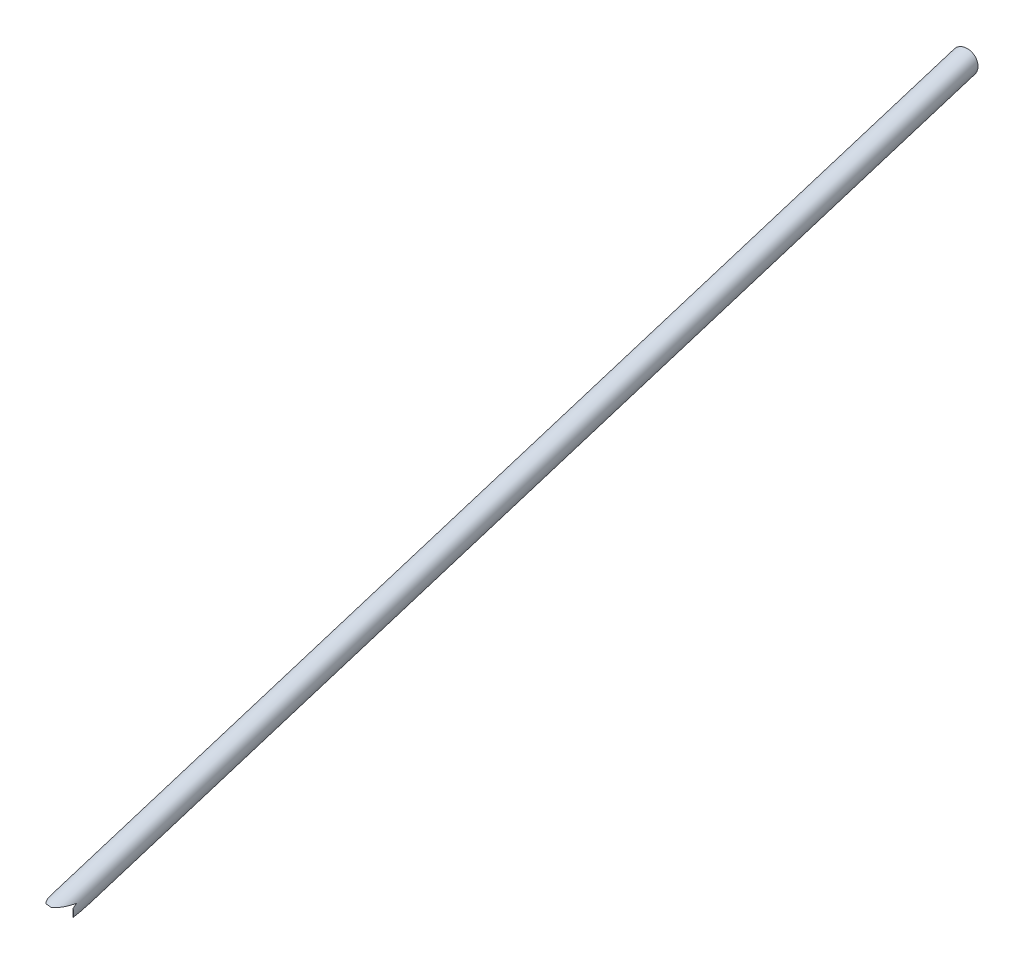
ISO-10303-21;
HEADER;
FILE_DESCRIPTION(('STEP AP214'),'2;1');
FILE_NAME('part.step','',(''),(''),'','','');
FILE_SCHEMA(('AUTOMOTIVE_DESIGN { 1 0 10303 214 1 1 1 1 }'));
ENDSEC;
DATA;
#1=APPLICATION_CONTEXT('core data for automotive mechanical design processes');
#2=APPLICATION_PROTOCOL_DEFINITION('international standard','automotive_design',2000,#1);
#3=PRODUCT_CONTEXT('',#1,'mechanical');
#4=PRODUCT('Part','Part','',(#3));
#5=PRODUCT_RELATED_PRODUCT_CATEGORY('part','',(#4));
#6=PRODUCT_DEFINITION_FORMATION('','',#4);
#7=PRODUCT_DEFINITION_CONTEXT('part definition',#1,'design');
#8=PRODUCT_DEFINITION('design','',#6,#7);
#9=PRODUCT_DEFINITION_SHAPE('','',#8);
#10=(LENGTH_UNIT() NAMED_UNIT(*) SI_UNIT(.MILLI.,.METRE.));
#11=(NAMED_UNIT(*) PLANE_ANGLE_UNIT() SI_UNIT($,.RADIAN.));
#12=(NAMED_UNIT(*) SI_UNIT($,.STERADIAN.) SOLID_ANGLE_UNIT());
#13=UNCERTAINTY_MEASURE_WITH_UNIT(LENGTH_MEASURE(1.E-05),#10,'distance_accuracy_value','');
#14=(GEOMETRIC_REPRESENTATION_CONTEXT(3) GLOBAL_UNCERTAINTY_ASSIGNED_CONTEXT((#13)) GLOBAL_UNIT_ASSIGNED_CONTEXT((#10,
#11,#12)) REPRESENTATION_CONTEXT('',''));
#15=CARTESIAN_POINT('',(0.,0.,0.));
#16=DIRECTION('',(0.,0.,1.));
#17=DIRECTION('',(1.,0.,0.));
#18=AXIS2_PLACEMENT_3D('',#15,#16,#17);
#19=CARTESIAN_POINT('',(-160.,500.,-1140.));
#20=DIRECTION('',(-0.0860700691861797,-0.397246473166983,0.913666888284061));
#21=DIRECTION('',(0.,-0.917070056253235,-0.39872611141445));
#22=AXIS2_PLACEMENT_3D('',#19,#20,#21);
#23=CYLINDRICAL_SURFACE('',#22,9.49999999999999);
#24=CARTESIAN_POINT('',(-225.,200.,-450.));
#25=DIRECTION('',(-0.49863554461385,-0.838230795587621,-0.220752637529415));
#26=DIRECTION('',(0.000808316338371599,-0.255121494909782,0.966908666555272));
#27=AXIS2_PLACEMENT_3D('',#24,#25,#26);
#28=ELLIPSE('',#27,54.5326857587044,9.49999999999999);
#29=CARTESIAN_POINT('',(-232.49120207117,210.,-471.05038645659));
#30=VERTEX_POINT('',#29);
#31=CARTESIAN_POINT('',(-221.081106849014,210.,-496.823483026899));
#32=VERTEX_POINT('',#31);
#33=EDGE_CURVE('E119',#30,#32,#28,.T.);
#34=ORIENTED_EDGE('',*,*,#33,.F.);
#35=CARTESIAN_POINT('',(-222.833333333333,210.,-473.));
#36=DIRECTION('',(0.,-1.,0.));
#37=DIRECTION('',(-0.0937876730808621,0.,0.995592221935305));
#38=AXIS2_PLACEMENT_3D('',#35,#36,#37);
#39=ELLIPSE('',#38,23.9146238965013,9.49999999999999);
#40=CARTESIAN_POINT('',(-227.003347225942,210.,-449.90274755166));
#41=VERTEX_POINT('',#40);
#42=EDGE_CURVE('E105',#41,#30,#39,.T.);
#43=ORIENTED_EDGE('',*,*,#42,.F.);
#44=CARTESIAN_POINT('',(-225.,200.,-450.));
#45=DIRECTION('',(-0.0976173982014038,-0.0292307759670222,0.994794654843277));
#46=DIRECTION('',(0.0124481025124146,-0.999526246810149,-0.0281482980206314));
#47=AXIS2_PLACEMENT_3D('',#44,#45,#46);
#48=ELLIPSE('',#47,10.2268785020854,9.49999999999999);
#49=CARTESIAN_POINT('',(-223.080085976711,210.,-449.517765029136));
#50=VERTEX_POINT('',#49);
#51=EDGE_CURVE('E113',#50,#41,#48,.T.);
#52=ORIENTED_EDGE('',*,*,#51,.F.);
#53=CARTESIAN_POINT('',(-215.,210.,-462.889777741708));
#54=VERTEX_POINT('',#53);
#55=EDGE_CURVE('E108',#54,#50,#39,.T.);
#56=ORIENTED_EDGE('',*,*,#55,.F.);
#57=CARTESIAN_POINT('',(-215.,246.153846153847,-556.153846153848));
#58=DIRECTION('',(-1.,0.,0.));
#59=DIRECTION('',(0.,-0.39872611141445,0.917070056253235));
#60=AXIS2_PLACEMENT_3D('',#57,#58,#59);
#61=ELLIPSE('',#60,110.375187214621,9.49999999999999);
#62=CARTESIAN_POINT('',(-215.,207.970881077854,-460.));
#63=VERTEX_POINT('',#62);
#64=EDGE_CURVE('E170',#63,#54,#61,.T.);
#65=ORIENTED_EDGE('',*,*,#64,.F.);
#66=CARTESIAN_POINT('',(-224.057971014493,204.347826086957,-460.));
#67=DIRECTION('',(0.,0.,1.));
#68=DIRECTION('',(-0.211753347005806,-0.977323140026797,0.));
#69=AXIS2_PLACEMENT_3D('',#66,#67,#68);
#70=ELLIPSE('',#69,10.3976625636962,9.49999999999999);
#71=CARTESIAN_POINT('',(-215.,201.460233271805,-460.));
#72=VERTEX_POINT('',#71);
#73=EDGE_CURVE('E124',#72,#63,#70,.T.);
#74=ORIENTED_EDGE('',*,*,#73,.F.);
#75=CARTESIAN_POINT('',(-215.,210.,-490.567372696074));
#76=VERTEX_POINT('',#75);
#77=EDGE_CURVE('E120',#76,#72,#61,.T.);
#78=ORIENTED_EDGE('',*,*,#77,.F.);
#79=CARTESIAN_POINT('',(-222.833333333333,210.,-473.));
#80=DIRECTION('',(0.,-1.,0.));
#81=DIRECTION('',(-0.0937876730808621,0.,0.995592221935305));
#82=AXIS2_PLACEMENT_3D('',#79,#80,#81);
#83=ELLIPSE('',#82,23.9146238965013,9.49999999999999);
#84=EDGE_CURVE('E172',#32,#76,#83,.T.);
#85=ORIENTED_EDGE('',*,*,#84,.F.);
#86=EDGE_LOOP('',(#34,#43,#52,#56,#65,#74,#78,#85));
#87=FACE_BOUND('',#86,.T.);
#88=CARTESIAN_POINT('',(-160.,500.,-1140.));
#89=DIRECTION('',(-0.133991346812806,0.0219122293107185,-0.990740214781819));
#90=DIRECTION('',(-0.480296136468892,-0.8759210569698,0.0455842434396291));
#91=AXIS2_PLACEMENT_3D('',#88,#89,#90);
#92=ELLIPSE('',#91,10.5277337911105,9.49999999999999);
#93=CARTESIAN_POINT('',(-165.056429865643,490.778536290194,-1139.52010122));
#94=VERTEX_POINT('',#93);
#95=EDGE_CURVE('E11',#94,#94,#92,.T.);
#96=ORIENTED_EDGE('',*,*,#95,.F.);
#97=EDGE_LOOP('',(#96));
#98=FACE_BOUND('',#97,.T.);
#99=ADVANCED_FACE('F41',(#87,#98),#23,.T.);
#100=CARTESIAN_POINT('',(-160.,500.,-1140.));
#101=DIRECTION('',(-0.0860700691861797,-0.397246473166983,0.913666888284061));
#102=DIRECTION('',(0.,-0.917070056253235,-0.39872611141445));
#103=AXIS2_PLACEMENT_3D('',#100,#101,#102);
#104=CYLINDRICAL_SURFACE('',#103,7.90000000000002);
#105=CARTESIAN_POINT('',(-222.833333333333,210.,-473.));
#106=DIRECTION('',(0.,-1.,0.));
#107=DIRECTION('',(-0.0937876730808621,0.,0.995592221935305));
#108=AXIS2_PLACEMENT_3D('',#105,#106,#107);
#109=ELLIPSE('',#108,19.8868977665643,7.90000000000002);
#110=CARTESIAN_POINT('',(-215.,210.,-471.932494813859));
#111=VERTEX_POINT('',#110);
#112=CARTESIAN_POINT('',(-230.584130699584,210.,-463.793581811255));
#113=VERTEX_POINT('',#112);
#114=EDGE_CURVE('E128',#111,#113,#109,.T.);
#115=ORIENTED_EDGE('',*,*,#114,.T.);
#116=CARTESIAN_POINT('',(-221.206568880777,210.263290182785,-493.4186666227));
#117=CARTESIAN_POINT('',(-221.109929501986,210.136842961336,-493.127842745663));
#118=CARTESIAN_POINT('',(-221.017562443006,210.012520663117,-492.834666204416));
#119=CARTESIAN_POINT('',(-220.839857957751,209.767514424618,-492.244671999629));
#120=CARTESIAN_POINT('',(-220.754521305051,209.646830885645,-491.94785393952));
#121=CARTESIAN_POINT('',(-220.589756177988,209.408619472013,-491.351203053453));
#122=CARTESIAN_POINT('',(-220.510329783082,209.29109271724,-491.051369208151));
#123=CARTESIAN_POINT('',(-220.356581816896,209.058896429864,-490.449291362299));
#124=CARTESIAN_POINT('',(-220.2822604407,208.94422700656,-490.147047270135));
#125=CARTESIAN_POINT('',(-220.065743365969,208.603789129551,-489.236470545524));
#126=CARTESIAN_POINT('',(-219.930211463608,208.381908407689,-488.625094419509));
#127=CARTESIAN_POINT('',(-219.673104031031,207.947093559278,-487.396444541229));
#128=CARTESIAN_POINT('',(-219.551525906144,207.734157774125,-486.779171908604));
#129=CARTESIAN_POINT('',(-219.319129065038,207.315250917297,-485.536628357625));
#130=CARTESIAN_POINT('',(-219.208368722641,207.109321162026,-484.911332655752));
#131=CARTESIAN_POINT('',(-218.996394850288,206.705091771442,-483.656650007088));
#132=CARTESIAN_POINT('',(-218.895181763587,206.506792490645,-483.027262871791));
#133=CARTESIAN_POINT('',(-218.700923893213,206.117826791356,-481.765453976174));
#134=CARTESIAN_POINT('',(-218.60787257728,205.927154336481,-481.133035077901));
#135=CARTESIAN_POINT('',(-218.428683060913,205.553401567545,-479.865003511438));
#136=CARTESIAN_POINT('',(-218.34254470469,205.37032108244,-479.229390915563));
#137=CARTESIAN_POINT('',(-218.146338222066,204.947843291744,-477.726391237358));
#138=CARTESIAN_POINT('',(-218.038782257532,204.711826522399,-476.857723509005));
#139=CARTESIAN_POINT('',(-217.832521257385,204.256501595717,-475.114750366068));
#140=CARTESIAN_POINT('',(-217.733818140724,204.037197062481,-474.240443773012));
#141=CARTESIAN_POINT('',(-217.591166933286,203.723940656647,-472.925723181726));
#142=CARTESIAN_POINT('',(-217.544566603265,203.622244406521,-472.487435385625));
#143=CARTESIAN_POINT('',(-217.452914506287,203.424724366042,-471.609379966866));
#144=CARTESIAN_POINT('',(-217.407862712539,203.328900474072,-471.169612369954));
#145=CARTESIAN_POINT('',(-217.319117315549,203.144072187073,-470.288589673283));
#146=CARTESIAN_POINT('',(-217.275423464497,203.055066543395,-469.847334861411));
#147=CARTESIAN_POINT('',(-217.18921174542,202.885112054427,-468.963171017037));
#148=CARTESIAN_POINT('',(-217.146693835213,202.804162919874,-468.52026204452));
#149=CARTESIAN_POINT('',(-217.060293515931,202.647639918606,-467.607268551179));
#150=CARTESIAN_POINT('',(-217.016472207586,202.57263852985,-467.137078973187));
#151=CARTESIAN_POINT('',(-216.929928621082,202.436236775548,-466.19454135032));
#152=CARTESIAN_POINT('',(-216.88720649617,202.374838297529,-465.722193015168));
#153=CARTESIAN_POINT('',(-216.802970922956,202.269443254468,-464.774889843165));
#154=CARTESIAN_POINT('',(-216.761458705491,202.225463874173,-464.299932898697));
#155=CARTESIAN_POINT('',(-216.700620774994,202.176840337672,-463.58624343732));
#156=CARTESIAN_POINT('',(-216.680581650158,202.163523843989,-463.348160005632));
#157=CARTESIAN_POINT('',(-216.64114828179,202.143616255257,-462.871664929639));
#158=CARTESIAN_POINT('',(-216.621754000335,202.137024764035,-462.633253305496));
#159=CARTESIAN_POINT('',(-216.578454507849,202.130885617397,-462.088422183723));
#160=CARTESIAN_POINT('',(-216.554834819952,202.133873968344,-461.781942259397));
#161=CARTESIAN_POINT('',(-216.509855183327,202.15557192883,-461.169266944286));
#162=CARTESIAN_POINT('',(-216.488495596774,202.174284053781,-460.863071606874));
#163=CARTESIAN_POINT('',(-216.449416897526,202.230848670641,-460.252776374438));
#164=CARTESIAN_POINT('',(-216.431690455975,202.268662086034,-459.948673481075));
#165=CARTESIAN_POINT('',(-216.401915460113,202.367406070103,-459.34394744731));
#166=CARTESIAN_POINT('',(-216.389863943999,202.428324549966,-459.043322571789));
#167=CARTESIAN_POINT('',(-216.377102129262,202.552879035823,-458.546205978982));
#168=CARTESIAN_POINT('',(-216.373968116411,202.609065548779,-458.347910371334));
#169=CARTESIAN_POINT('',(-216.37296448047,202.734737124114,-457.955589160142));
#170=CARTESIAN_POINT('',(-216.375093001204,202.804217489574,-457.761562075381));
#171=CARTESIAN_POINT('',(-216.386082953104,202.957073681046,-457.379483405302));
#172=CARTESIAN_POINT('',(-216.394936341446,203.040432815376,-457.191424961284));
#173=CARTESIAN_POINT('',(-216.420991827636,203.221183804626,-456.822743561291));
#174=CARTESIAN_POINT('',(-216.43819367232,203.318575233962,-456.642120380027));
#175=CARTESIAN_POINT('',(-216.482785559098,203.527679648324,-456.288367879617));
#176=CARTESIAN_POINT('',(-216.510268345109,203.639516742879,-456.11532330574));
#177=CARTESIAN_POINT('',(-216.576919637875,203.875284472336,-455.780039397465));
#178=CARTESIAN_POINT('',(-216.616088451841,203.999215425112,-455.617800347269));
#179=CARTESIAN_POINT('',(-216.70733824113,204.257048130729,-455.305137934336));
#180=CARTESIAN_POINT('',(-216.75942760476,204.390956321343,-455.154722331517));
#181=CARTESIAN_POINT('',(-216.877304852826,204.666042500061,-454.86644817353));
#182=CARTESIAN_POINT('',(-216.943092145311,204.807220173819,-454.728589076106));
#183=CARTESIAN_POINT('',(-217.080299643402,205.077443251456,-454.480854440107));
#184=CARTESIAN_POINT('',(-217.150184372386,205.205999443478,-454.369587235848));
#185=CARTESIAN_POINT('',(-217.300982696953,205.464765393563,-454.156922627876));
#186=CARTESIAN_POINT('',(-217.381895180796,205.594974983743,-454.055524231021));
#187=CARTESIAN_POINT('',(-217.554610558675,205.855335682745,-453.862376420539));
#188=CARTESIAN_POINT('',(-217.64641434967,205.985486785863,-453.770627802801));
#189=CARTESIAN_POINT('',(-217.840615597317,206.244160546697,-453.596521297254));
#190=CARTESIAN_POINT('',(-217.943013751916,206.372683096498,-453.514164028893));
#191=CARTESIAN_POINT('',(-218.164859963187,206.634814707654,-453.353606939399));
#192=CARTESIAN_POINT('',(-218.284979249916,206.768224428268,-453.276008522712));
#193=CARTESIAN_POINT('',(-218.536131134663,207.030141998654,-453.13085764722));
#194=CARTESIAN_POINT('',(-218.667164041463,207.158649709581,-453.063305472806));
#195=CARTESIAN_POINT('',(-218.939462028606,207.40951486687,-452.938012640242));
#196=CARTESIAN_POINT('',(-219.080729090632,207.531871114284,-452.880273889588));
#197=CARTESIAN_POINT('',(-219.372684478254,207.769316539419,-452.774478474727));
#198=CARTESIAN_POINT('',(-219.523373166337,207.884405437194,-452.726422183342));
#199=CARTESIAN_POINT('',(-219.843297026476,208.11354032734,-452.637145979249));
#200=CARTESIAN_POINT('',(-220.013101621427,208.227041649849,-452.596565793413));
#201=CARTESIAN_POINT('',(-220.36128246733,208.443830609862,-452.526346091106));
#202=CARTESIAN_POINT('',(-220.539659093659,208.547117799472,-452.496707054252));
#203=CARTESIAN_POINT('',(-220.903804713949,208.742757725071,-452.44851763157));
#204=CARTESIAN_POINT('',(-221.089575214476,208.835108217216,-452.429969518077));
#205=CARTESIAN_POINT('',(-221.467171463491,209.008295903055,-452.404237383107));
#206=CARTESIAN_POINT('',(-221.658997213345,209.089133094152,-452.397053364191));
#207=CARTESIAN_POINT('',(-222.050674872624,209.240226732983,-452.39440663564));
#208=CARTESIAN_POINT('',(-222.250608221155,209.310275958647,-452.399148838159));
#209=CARTESIAN_POINT('',(-222.653732813281,209.437910323671,-452.421307544134));
#210=CARTESIAN_POINT('',(-222.856924125083,209.495495201714,-452.438724313279));
#211=CARTESIAN_POINT('',(-223.264893073602,209.598265539927,-452.486870525803));
#212=CARTESIAN_POINT('',(-223.469670903985,209.643449460993,-452.517601620425));
#213=CARTESIAN_POINT('',(-223.878952898201,209.721725473911,-452.593110072511));
#214=CARTESIAN_POINT('',(-224.083457068911,209.754817875486,-452.637887070135));
#215=CARTESIAN_POINT('',(-224.486209773873,209.808985578965,-452.741254849752));
#216=CARTESIAN_POINT('',(-224.684502251567,209.830284336225,-452.799556760406));
#217=CARTESIAN_POINT('',(-225.076907481233,209.862732983582,-452.931167032426));
#218=CARTESIAN_POINT('',(-225.271020278113,209.873882982776,-453.004475232466));
#219=CARTESIAN_POINT('',(-225.652732580312,209.887240428245,-453.166649232188));
#220=CARTESIAN_POINT('',(-225.840338560189,209.889457032387,-453.25549900221));
#221=CARTESIAN_POINT('',(-226.20704655469,209.886515009221,-453.449188120934));
#222=CARTESIAN_POINT('',(-226.386149378347,209.881357085025,-453.554025944434));
#223=CARTESIAN_POINT('',(-226.720875418022,209.866088552439,-453.771298016032));
#224=CARTESIAN_POINT('',(-226.877255319011,209.856372760919,-453.882595739804));
#225=CARTESIAN_POINT('',(-227.179444557548,209.833787945017,-454.118410569699));
#226=CARTESIAN_POINT('',(-227.325254925423,209.820919228523,-454.242926384389));
#227=CARTESIAN_POINT('',(-227.605142945796,209.79364276433,-454.5042413076));
#228=CARTESIAN_POINT('',(-227.739225142311,209.779235617535,-454.64103561689));
#229=CARTESIAN_POINT('',(-227.995090983964,209.750360195388,-454.925667150244));
#230=CARTESIAN_POINT('',(-228.11687316059,209.735891912952,-455.073505689235));
#231=CARTESIAN_POINT('',(-228.373129183144,209.705131291008,-455.411857449463));
#232=CARTESIAN_POINT('',(-228.504611631914,209.689125636007,-455.604663676196));
#233=CARTESIAN_POINT('',(-228.749890447184,209.660506313658,-456.001427941316));
#234=CARTESIAN_POINT('',(-228.863681874679,209.647893592839,-456.20538907254));
#235=CARTESIAN_POINT('',(-229.075241208414,209.626966974276,-456.622081600324));
#236=CARTESIAN_POINT('',(-229.172978972358,209.618661101413,-456.8348285771));
#237=CARTESIAN_POINT('',(-229.354024280217,209.606748465328,-457.266426555724));
#238=CARTESIAN_POINT('',(-229.437332509042,209.603141479017,-457.485277267281));
#239=CARTESIAN_POINT('',(-229.606268653224,209.600363856652,-457.969807934708));
#240=CARTESIAN_POINT('',(-229.689265321221,209.602179056778,-458.236404425408));
#241=CARTESIAN_POINT('',(-229.840534439899,209.612019235378,-458.773680413806));
#242=CARTESIAN_POINT('',(-229.908800345939,209.620046966745,-459.044361669393));
#243=CARTESIAN_POINT('',(-230.033239370077,209.641682839963,-459.588720357564));
#244=CARTESIAN_POINT('',(-230.089391483546,209.655300557756,-459.862402143303));
#245=CARTESIAN_POINT('',(-230.191555165214,209.687420470704,-460.411298638274));
#246=CARTESIAN_POINT('',(-230.237568117765,209.705921998288,-460.68651313297));
#247=CARTESIAN_POINT('',(-230.321535675547,209.747336970577,-461.240411430842));
#248=CARTESIAN_POINT('',(-230.359412647116,209.770289257051,-461.51910392818));
#249=CARTESIAN_POINT('',(-230.427949419992,209.819881254701,-462.07704174499));
#250=CARTESIAN_POINT('',(-230.458609030468,209.846521063347,-462.356287078881));
#251=CARTESIAN_POINT('',(-230.513767367169,209.902914092491,-462.914714601476));
#252=CARTESIAN_POINT('',(-230.538273579591,209.932663466854,-463.193896450007));
#253=CARTESIAN_POINT('',(-230.582035657683,209.994836673069,-463.752358490195));
#254=CARTESIAN_POINT('',(-230.601291687124,210.027260421458,-464.031638678513));
#255=CARTESIAN_POINT('',(-230.636353193236,210.096573277037,-464.608433674737));
#256=CARTESIAN_POINT('',(-230.651851300254,210.133615712017,-464.905948513583));
#257=CARTESIAN_POINT('',(-230.678331980118,210.209869885286,-465.500903414425));
#258=CARTESIAN_POINT('',(-230.689314435703,210.249081679878,-465.798343474279));
#259=CARTESIAN_POINT('',(-230.716307066158,210.369436825246,-466.690548480742));
#260=CARTESIAN_POINT('',(-230.726358678818,210.453291693704,-467.285131034722));
#261=CARTESIAN_POINT('',(-230.733620772071,210.626005382562,-468.473941841788));
#262=CARTESIAN_POINT('',(-230.730824252652,210.714866904678,-469.068169725283));
#263=CARTESIAN_POINT('',(-230.714293806322,210.895870557495,-470.255982246404));
#264=CARTESIAN_POINT('',(-230.700559570353,210.988012780826,-470.849566865379));
#265=CARTESIAN_POINT('',(-230.663327122498,211.17461154344,-472.038404502628));
#266=CARTESIAN_POINT('',(-230.639791485112,211.269075633335,-472.633655134474));
#267=CARTESIAN_POINT('',(-230.583722751561,211.458892875942,-473.82359615666));
#268=CARTESIAN_POINT('',(-230.551189527775,211.554246041244,-474.418286538933));
#269=CARTESIAN_POINT('',(-230.47755687673,211.744875172433,-475.606859166656));
#270=CARTESIAN_POINT('',(-230.436461495208,211.840151153522,-476.200741660922));
#271=CARTESIAN_POINT('',(-230.34582350537,212.02984774027,-477.387994148553));
#272=CARTESIAN_POINT('',(-230.296280961183,212.124268352418,-477.981364145775));
#273=CARTESIAN_POINT('',(-230.189090478444,212.310664607018,-479.162459240515));
#274=CARTESIAN_POINT('',(-230.131516311106,212.402654329382,-479.75018879338));
#275=CARTESIAN_POINT('',(-230.007582599739,212.584256085965,-480.925098846293));
#276=CARTESIAN_POINT('',(-229.941222942009,212.673868089394,-481.512279339136));
#277=CARTESIAN_POINT('',(-229.799042412219,212.849950407661,-482.686441594307));
#278=CARTESIAN_POINT('',(-229.723214345328,212.936418268122,-483.273422861462));
#279=CARTESIAN_POINT('',(-229.601688158053,213.062979041458,-484.153251532056));
#280=CARTESIAN_POINT('',(-229.559883125713,213.104641546551,-484.446413856564));
#281=CARTESIAN_POINT('',(-229.473510284641,213.18677879141,-485.03251107231));
#282=CARTESIAN_POINT('',(-229.428942355936,213.227253479486,-485.325445953112));
#283=CARTESIAN_POINT('',(-229.291256282562,213.346289506245,-486.201082373783));
#284=CARTESIAN_POINT('',(-229.193777596682,213.422862868369,-486.783378199634));
#285=CARTESIAN_POINT('',(-228.985200045923,213.569170066154,-487.946387303832));
#286=CARTESIAN_POINT('',(-228.874102053123,213.638904339225,-488.527100681075));
#287=CARTESIAN_POINT('',(-228.695035806717,213.736692267697,-489.396041738902));
#288=CARTESIAN_POINT('',(-228.633313708862,213.768137580331,-489.685178994076));
#289=CARTESIAN_POINT('',(-228.505180149083,213.8283932843,-490.262684504271));
#290=CARTESIAN_POINT('',(-228.438768842652,213.857203762933,-490.551052784462));
#291=CARTESIAN_POINT('',(-228.300619366888,213.911717811544,-491.12671641976));
#292=CARTESIAN_POINT('',(-228.228882822597,213.937422323092,-491.414012074309));
#293=CARTESIAN_POINT('',(-228.079211572878,213.985128483574,-491.987284692016));
#294=CARTESIAN_POINT('',(-228.001277392732,214.007130445826,-492.273261764761));
#295=CARTESIAN_POINT('',(-227.879015745448,214.036700422767,-492.700322003988));
#296=CARTESIAN_POINT('',(-227.837455048745,214.045970105621,-492.84208214329));
#297=CARTESIAN_POINT('',(-227.752319330029,214.063254203723,-493.125079895621));
#298=CARTESIAN_POINT('',(-227.70874424099,214.071268577163,-493.266317491095));
#299=CARTESIAN_POINT('',(-227.619343104506,214.085893844566,-493.548246991996));
#300=CARTESIAN_POINT('',(-227.573515753437,214.092503913642,-493.688938529302));
#301=CARTESIAN_POINT('',(-227.479371864174,214.104122291894,-493.969548083376));
#302=CARTESIAN_POINT('',(-227.431055299494,214.109130584023,-494.109466091897));
#303=CARTESIAN_POINT('',(-227.281767479739,214.121450335952,-494.528306113324));
#304=CARTESIAN_POINT('',(-227.176597307463,214.126032289878,-494.805868482431));
#305=CARTESIAN_POINT('',(-227.007939470701,214.12549400941,-495.217618985975));
#306=CARTESIAN_POINT('',(-226.949922970316,214.124080982314,-495.354061632223));
#307=CARTESIAN_POINT('',(-226.829618951389,214.118298412209,-495.6249783829));
#308=CARTESIAN_POINT('',(-226.767332135837,214.113929354785,-495.75945280694));
#309=CARTESIAN_POINT('',(-226.637056199118,214.101555259127,-496.027142174244));
#310=CARTESIAN_POINT('',(-226.569015944522,214.093514027753,-496.160330773722));
#311=CARTESIAN_POINT('',(-226.426763940264,214.072917018282,-496.422980223148));
#312=CARTESIAN_POINT('',(-226.352555006298,214.060363291312,-496.552442737933));
#313=CARTESIAN_POINT('',(-226.19699948478,214.029616689099,-496.805382786731));
#314=CARTESIAN_POINT('',(-226.115694511434,214.011455290476,-496.928889386252));
#315=CARTESIAN_POINT('',(-225.943957086964,213.967821618051,-497.167912209432));
#316=CARTESIAN_POINT('',(-225.85354048666,213.942361902942,-497.283441739584));
#317=CARTESIAN_POINT('',(-225.688005734206,213.890169687143,-497.471893351227));
#318=CARTESIAN_POINT('',(-225.61556300722,213.865732419693,-497.547768255142));
#319=CARTESIAN_POINT('',(-225.463999467697,213.810685186005,-497.690347635858));
#320=CARTESIAN_POINT('',(-225.384873997014,213.780070893136,-497.757045629405));
#321=CARTESIAN_POINT('',(-225.2186927266,213.711159195373,-497.878128205912));
#322=CARTESIAN_POINT('',(-225.13154481225,213.672764267749,-497.932335676985));
#323=CARTESIAN_POINT('',(-224.951682981077,213.588147299334,-498.022113608058));
#324=CARTESIAN_POINT('',(-224.85898508616,213.541947148376,-498.057735080786));
#325=CARTESIAN_POINT('',(-224.680348169062,213.447491674599,-498.104095540645));
#326=CARTESIAN_POINT('',(-224.594618592823,213.399863375799,-498.116901462521));
#327=CARTESIAN_POINT('',(-224.424567947105,213.300846894172,-498.123639027271));
#328=CARTESIAN_POINT('',(-224.340248357002,213.24945503358,-498.11755196091));
#329=CARTESIAN_POINT('',(-224.16569608421,213.138658475796,-498.086825418936));
#330=CARTESIAN_POINT('',(-224.076001030045,213.079042369976,-498.060008485378));
#331=CARTESIAN_POINT('',(-223.903335717375,212.959801133329,-497.989949902335));
#332=CARTESIAN_POINT('',(-223.820377790738,212.900176177568,-497.946678922098));
#333=CARTESIAN_POINT('',(-223.673269247817,212.790942451997,-497.855509706442));
#334=CARTESIAN_POINT('',(-223.608166462034,212.741175881611,-497.809286001163));
#335=CARTESIAN_POINT('',(-223.482412314241,212.642653940838,-497.710120500615));
#336=CARTESIAN_POINT('',(-223.421764471679,212.593899391315,-497.657173482075));
#337=CARTESIAN_POINT('',(-223.304316377248,212.497386153325,-497.545958736407));
#338=CARTESIAN_POINT('',(-223.247527453968,212.449630659716,-497.487676430627));
#339=CARTESIAN_POINT('',(-223.137512113781,212.355255895653,-497.367055092986));
#340=CARTESIAN_POINT('',(-223.084284541324,212.3086362598,-497.304717390053));
#341=CARTESIAN_POINT('',(-222.954548212183,212.19293213217,-497.144154085083));
#342=CARTESIAN_POINT('',(-222.880018578733,212.124522832017,-497.043846868796));
#343=CARTESIAN_POINT('',(-222.736744881905,211.989841523395,-496.837777130535));
#344=CARTESIAN_POINT('',(-222.668003978854,211.923570694435,-496.732011678832));
#345=CARTESIAN_POINT('',(-222.535261896086,211.792827358263,-496.516163072543));
#346=CARTESIAN_POINT('',(-222.471269361961,211.728358258399,-496.4060725746));
#347=CARTESIAN_POINT('',(-222.347406042486,211.601112440623,-496.182631709451));
#348=CARTESIAN_POINT('',(-222.287535989804,211.538336024742,-496.069280767831));
#349=CARTESIAN_POINT('',(-222.112886253479,211.351919904908,-495.724720256595));
#350=CARTESIAN_POINT('',(-222.00341790578,211.230543568244,-495.489592519446));
#351=CARTESIAN_POINT('',(-221.795345031806,210.992782249377,-495.012558763906));
#352=CARTESIAN_POINT('',(-221.696729966179,210.876392493137,-494.770659612647));
#353=CARTESIAN_POINT('',(-221.532021957414,210.676721723793,-494.343882897687));
#354=CARTESIAN_POINT('',(-221.464035668955,210.592547526948,-494.160147035209));
#355=CARTESIAN_POINT('',(-221.365198830821,210.467875750618,-493.883026607317));
#356=CARTESIAN_POINT('',(-221.332815994982,210.426634613568,-493.790518410493));
#357=CARTESIAN_POINT('',(-221.268998606858,210.344619533848,-493.604976334729));
#358=CARTESIAN_POINT('',(-221.237564002266,210.303845565486,-493.511942485125));
#359=CARTESIAN_POINT('',(-221.206568880777,210.263290182785,-493.4186666227));
#360=B_SPLINE_CURVE_WITH_KNOTS('',3,(#116,#117,#118,#119,#120,#121,#122,#123,#124,#125,#126,
#127,#128,#129,#130,#131,#132,#133,#134,#135,#136,#137,#138,#139,#140,#141,#142,#143,#144,#145,
#146,#147,#148,#149,#150,#151,#152,#153,#154,#155,#156,#157,#158,#159,#160,#161,#162,#163,#164,
#165,#166,#167,#168,#169,#170,#171,#172,#173,#174,#175,#176,#177,#178,#179,#180,#181,#182,#183,
#184,#185,#186,#187,#188,#189,#190,#191,#192,#193,#194,#195,#196,#197,#198,#199,#200,#201,#202,
#203,#204,#205,#206,#207,#208,#209,#210,#211,#212,#213,#214,#215,#216,#217,#218,#219,#220,#221,
#222,#223,#224,#225,#226,#227,#228,#229,#230,#231,#232,#233,#234,#235,#236,#237,#238,#239,#240,
#241,#242,#243,#244,#245,#246,#247,#248,#249,#250,#251,#252,#253,#254,#255,#256,#257,#258,#259,
#260,#261,#262,#263,#264,#265,#266,#267,#268,#269,#270,#271,#272,#273,#274,#275,#276,#277,#278,
#279,#280,#281,#282,#283,#284,#285,#286,#287,#288,#289,#290,#291,#292,#293,#294,#295,#296,#297,
#298,#299,#300,#301,#302,#303,#304,#305,#306,#307,#308,#309,#310,#311,#312,#313,#314,#315,#316,
#317,#318,#319,#320,#321,#322,#323,#324,#325,#326,#327,#328,#329,#330,#331,#332,#333,#334,#335,
#336,#337,#338,#339,#340,#341,#342,#343,#344,#345,#346,#347,#348,#349,#350,#351,#352,#353,#354,
#355,#356,#357,#358,#359),.UNSPECIFIED.,.T.,.F.,(4,2,2,2,2,2,2,2,2,2,2,2,2,2,2,2,2,2,2,2,2,2,2,
2,2,2,2,2,2,2,2,2,2,2,2,2,2,2,2,2,2,2,2,2,2,2,2,2,2,2,2,2,2,2,2,2,2,2,2,2,2,2,2,2,2,2,2,2,2,2,2,
2,2,2,2,2,2,2,2,2,2,2,2,2,2,2,2,2,2,2,2,2,2,2,2,2,2,2,2,2,2,2,2,2,2,2,2,2,2,2,2,2,2,2,2,2,2,2,2,
2,2,4),(0.,0.994554333141093,1.98921795402704,2.98422989720755,3.97927984304103,
5.97204339293409,7.96443579099331,9.96704559370212,11.9697483268758,13.9708332889279,
15.9718731425341,18.6913576407705,21.411430199335,22.7684108303094,24.125367973221,
25.4820760148545,26.8387353270628,28.2730103841277,29.707484335322,31.143369957468,
31.8611800930425,32.5789479397448,33.5008221943298,34.4228439540183,35.3429870783088,
36.2626494366835,36.8805700988557,37.4982728421617,38.1152379848461,38.7321844195816,
39.354836041469,39.9775040335253,40.6005773383537,41.2236237228813,41.7744914447747,
42.325303673057,42.8761612953384,43.4270552307984,44.0131310818752,44.5992235206499,
45.1854297519973,45.7716585509004,46.3956475653794,47.019663929905,47.6438081007107,
48.2679524122183,48.9028935545918,49.5378480072416,50.1728812295496,50.8078981843789,
51.4304313039967,52.0529577314441,52.6748458275623,53.2966746349045,53.8724801207269,
54.448229400872,55.0237546127522,55.5993484562011,56.3000020879703,57.0008509793244,
57.7030011004968,58.4051178844155,59.2421724173967,60.0795980780405,60.9184643196763,
61.7572159554327,62.6036466415182,63.4500997051559,64.2955179331587,65.1409097866037,
66.0414970992011,66.9421077965368,68.7435325987042,70.5459389824368,72.3483962972102,
74.1578001211245,75.9672296108375,77.7758060516428,79.5843687627229,81.3772969602804,
83.1702483638748,84.9645705777381,85.8616906713554,86.7588497481916,88.5447191009519,
90.3304741597897,91.2223928394874,92.1142819572654,93.0059000176643,93.8974425892034,
94.3414784233109,94.7855290428903,95.2298397806438,95.6741552466959,96.5641877492738,
97.008925518644,97.4535902491814,97.9027354929587,98.351676838325,98.7981426691179,
99.2438448017484,99.5664016167764,99.8891851525642,100.216297098327,100.542506437957,
100.837282015699,101.132349595117,101.463496059634,101.795235609634,102.07708539607,
102.359155503887,102.642020785949,102.924793837184,103.351854384507,103.779146591871,
104.207198615257,104.635326518924,105.49388822654,106.351608709695,106.991223373765,
107.310224142151,107.629207281007),.UNSPECIFIED.);
#361=CARTESIAN_POINT('',(-221.009082769324,210.,-492.802823508088));
#362=VERTEX_POINT('',#361);
#363=EDGE_CURVE('E130',#113,#362,#360,.T.);
#364=ORIENTED_EDGE('',*,*,#363,.T.);
#365=CARTESIAN_POINT('',(-222.833333333333,210.,-473.));
#366=DIRECTION('',(0.,-1.,0.));
#367=DIRECTION('',(-0.0937876730808621,0.,0.995592221935305));
#368=AXIS2_PLACEMENT_3D('',#365,#366,#367);
#369=ELLIPSE('',#368,19.8868977665643,7.90000000000002);
#370=CARTESIAN_POINT('',(-215.,210.,-481.524655623924));
#371=VERTEX_POINT('',#370);
#372=EDGE_CURVE('E136',#362,#371,#369,.T.);
#373=ORIENTED_EDGE('',*,*,#372,.T.);
#374=CARTESIAN_POINT('',(-215.,246.153846153847,-556.153846153848));
#375=DIRECTION('',(-1.,0.,0.));
#376=DIRECTION('',(0.,-0.39872611141445,0.917070056253235));
#377=AXIS2_PLACEMENT_3D('',#374,#375,#376);
#378=ELLIPSE('',#377,91.7856819995275,7.90000000000002);
#379=EDGE_CURVE('E86',#371,#111,#378,.T.);
#380=ORIENTED_EDGE('',*,*,#379,.T.);
#381=EDGE_LOOP('',(#115,#364,#373,#380));
#382=FACE_BOUND('',#381,.T.);
#383=CARTESIAN_POINT('',(-160.,500.,-1140.));
#384=DIRECTION('',(-0.133991346812806,0.0219122293107185,-0.990740214781819));
#385=DIRECTION('',(-0.480296136468892,-0.8759210569698,0.0455842434396291));
#386=AXIS2_PLACEMENT_3D('',#383,#384,#385);
#387=ELLIPSE('',#386,8.75464178418664,7.90000000000002);
#388=CARTESIAN_POINT('',(-164.204820625114,492.331624915003,-1139.60092627768));
#389=VERTEX_POINT('',#388);
#390=EDGE_CURVE('E45',#389,#389,#387,.T.);
#391=ORIENTED_EDGE('',*,*,#390,.T.);
#392=EDGE_LOOP('',(#391));
#393=FACE_BOUND('',#392,.T.);
#394=ADVANCED_FACE('F138',(#382,#393),#104,.F.);
#395=CARTESIAN_POINT('',(-225.,200.,-450.));
#396=DIRECTION('',(-0.0876619818920292,0.105194378270435,-0.99058039537993));
#397=DIRECTION('',(0.,0.994408591727349,0.105600912395825));
#398=AXIS2_PLACEMENT_3D('',#395,#396,#397);
#399=CYLINDRICAL_SURFACE('',#398,9.49999999999999);
#400=ORIENTED_EDGE('',*,*,#33,.T.);
#401=CARTESIAN_POINT('',(-233.333333333333,210.,-544.166666666664));
#402=DIRECTION('',(0.,-1.,0.));
#403=DIRECTION('',(-0.0881510722971012,0.,-0.996107116957243));
#404=AXIS2_PLACEMENT_3D('',#401,#402,#403);
#405=ELLIPSE('',#404,90.3090084869104,9.49999999999999);
#406=EDGE_CURVE('E60',#32,#362,#405,.T.);
#407=ORIENTED_EDGE('',*,*,#406,.T.);
#408=ORIENTED_EDGE('',*,*,#363,.F.);
#409=EDGE_CURVE('E173',#113,#30,#405,.T.);
#410=ORIENTED_EDGE('',*,*,#409,.T.);
#411=EDGE_LOOP('',(#400,#407,#408,#410));
#412=FACE_BOUND('',#411,.T.);
#413=ADVANCED_FACE('F141',(#412),#399,.F.);
#414=CARTESIAN_POINT('',(225.,190.,-460.));
#415=DIRECTION('',(0.,0.,1.));
#416=DIRECTION('',(1.,0.,0.));
#417=AXIS2_PLACEMENT_3D('',#414,#415,#416);
#418=PLANE('',#417);
#419=ORIENTED_EDGE('',*,*,#73,.T.);
#420=DIRECTION('',(0.,-1.,0.));
#421=VECTOR('',#420,1.);
#422=CARTESIAN_POINT('',(-215.,190.,-460.));
#423=LINE('',#422,#421);
#424=EDGE_CURVE('E92',#63,#72,#423,.T.);
#425=ORIENTED_EDGE('',*,*,#424,.T.);
#426=EDGE_LOOP('',(#419,#425));
#427=FACE_BOUND('',#426,.T.);
#428=ADVANCED_FACE('F146',(#427),#418,.T.);
#429=CARTESIAN_POINT('',(-169.428571428571,0.,-995.));
#430=DIRECTION('',(-0.0952883546426031,0.34294009382942,0.934511755685168));
#431=DIRECTION('',(0.,-0.938783490773443,0.344507703036126));
#432=AXIS2_PLACEMENT_3D('',#429,#430,#431);
#433=CYLINDRICAL_SURFACE('',#432,9.49999999999999);
#434=ORIENTED_EDGE('',*,*,#51,.T.);
#435=CARTESIAN_POINT('',(-227.778571428571,210.,-422.750000000001));
#436=DIRECTION('',(0.,-1.,0.));
#437=DIRECTION('',(-0.101439949498849,0.,0.99484166410825));
#438=AXIS2_PLACEMENT_3D('',#435,#436,#437);
#439=ELLIPSE('',#438,27.7016311913804,9.49999999999999);
#440=EDGE_CURVE('E101',#41,#50,#439,.T.);
#441=ORIENTED_EDGE('',*,*,#440,.T.);
#442=EDGE_LOOP('',(#434,#441));
#443=FACE_BOUND('',#442,.T.);
#444=ADVANCED_FACE('F122',(#443),#433,.F.);
#445=CARTESIAN_POINT('',(225.,210.,-460.));
#446=DIRECTION('',(0.,-1.,0.));
#447=DIRECTION('',(0.,0.,-1.));
#448=AXIS2_PLACEMENT_3D('',#445,#446,#447);
#449=PLANE('',#448);
#450=ORIENTED_EDGE('',*,*,#114,.F.);
#451=DIRECTION('',(0.,0.,1.));
#452=VECTOR('',#451,1.);
#453=CARTESIAN_POINT('',(-215.,210.,-450.));
#454=LINE('',#453,#452);
#455=EDGE_CURVE('E112',#111,#54,#454,.T.);
#456=ORIENTED_EDGE('',*,*,#455,.T.);
#457=ORIENTED_EDGE('',*,*,#55,.T.);
#458=ORIENTED_EDGE('',*,*,#440,.F.);
#459=ORIENTED_EDGE('',*,*,#42,.T.);
#460=ORIENTED_EDGE('',*,*,#409,.F.);
#461=EDGE_LOOP('',(#450,#456,#457,#458,#459,#460));
#462=FACE_BOUND('',#461,.T.);
#463=ADVANCED_FACE('F103',(#462),#449,.T.);
#464=CARTESIAN_POINT('',(-215.,190.,-450.));
#465=DIRECTION('',(-1.,0.,0.));
#466=DIRECTION('',(0.,0.,1.));
#467=AXIS2_PLACEMENT_3D('',#464,#465,#466);
#468=PLANE('',#467);
#469=EDGE_CURVE('E51',#76,#371,#454,.T.);
#470=ORIENTED_EDGE('',*,*,#469,.F.);
#471=ORIENTED_EDGE('',*,*,#77,.T.);
#472=ORIENTED_EDGE('',*,*,#424,.F.);
#473=ORIENTED_EDGE('',*,*,#64,.T.);
#474=ORIENTED_EDGE('',*,*,#455,.F.);
#475=ORIENTED_EDGE('',*,*,#379,.F.);
#476=EDGE_LOOP('',(#470,#471,#472,#473,#474,#475));
#477=FACE_BOUND('',#476,.T.);
#478=ADVANCED_FACE('F149',(#477),#468,.T.);
#479=CARTESIAN_POINT('',(-235.,210.,-450.));
#480=DIRECTION('',(0.,-1.,0.));
#481=DIRECTION('',(0.,0.,-1.));
#482=AXIS2_PLACEMENT_3D('',#479,#480,#481);
#483=PLANE('',#482);
#484=ORIENTED_EDGE('',*,*,#84,.T.);
#485=ORIENTED_EDGE('',*,*,#469,.T.);
#486=ORIENTED_EDGE('',*,*,#372,.F.);
#487=ORIENTED_EDGE('',*,*,#406,.F.);
#488=EDGE_LOOP('',(#484,#485,#486,#487));
#489=FACE_BOUND('',#488,.T.);
#490=ADVANCED_FACE('F152',(#489),#483,.T.);
#491=CARTESIAN_POINT('',(-160.,500.,-1140.));
#492=DIRECTION('',(-0.133991346812806,0.0219122293107185,-0.990740214781819));
#493=DIRECTION('',(-0.990978150341289,0.,0.134023526092089));
#494=AXIS2_PLACEMENT_3D('',#491,#492,#493);
#495=PLANE('',#494);
#496=ORIENTED_EDGE('',*,*,#390,.F.);
#497=EDGE_LOOP('',(#496));
#498=FACE_BOUND('',#497,.T.);
#499=ORIENTED_EDGE('',*,*,#95,.T.);
#500=EDGE_LOOP('',(#499));
#501=FACE_BOUND('',#500,.T.);
#502=ADVANCED_FACE('F43',(#498,#501),#495,.T.);
#503=CLOSED_SHELL('',(#99,#394,#413,#428,#444,#463,#478,#490,#502));
#504=MANIFOLD_SOLID_BREP('B2',#503);
#505=ADVANCED_BREP_SHAPE_REPRESENTATION('',(#18,#504),#14);
#506=SHAPE_DEFINITION_REPRESENTATION(#9,#505);
ENDSEC;
END-ISO-10303-21;
